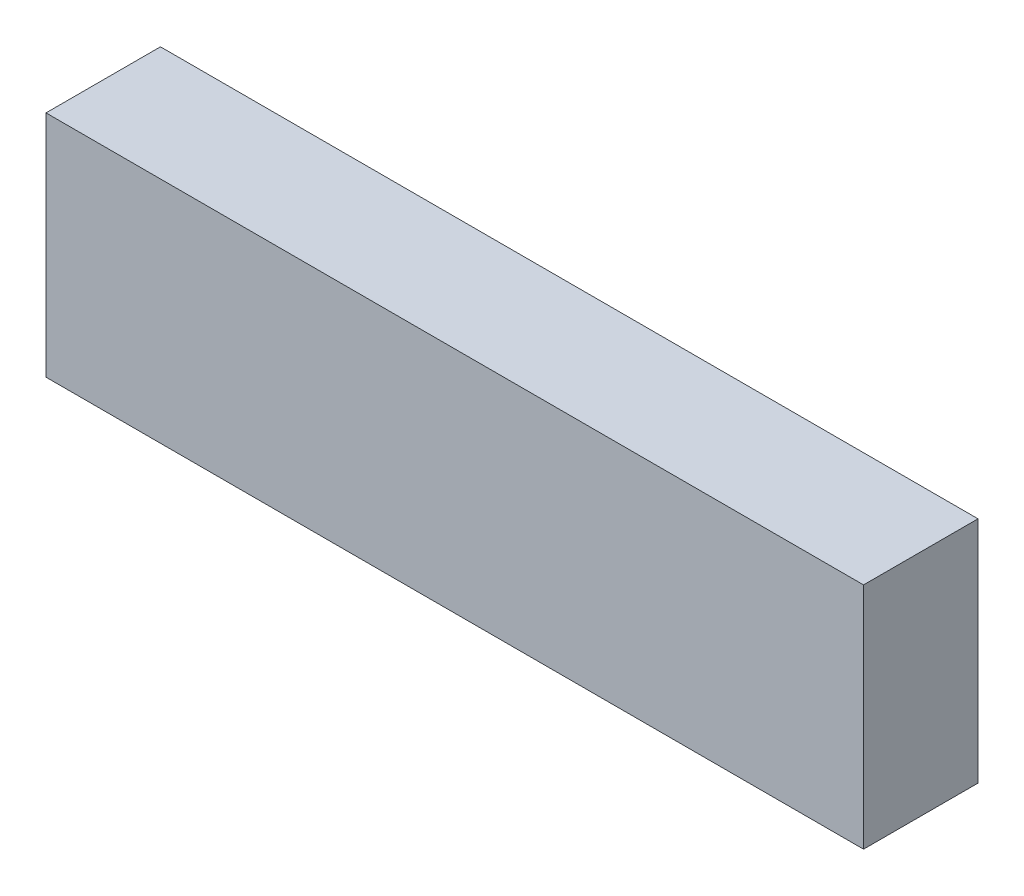
ISO-10303-21;
HEADER;
FILE_DESCRIPTION(('STEP AP214'),'2;1');
FILE_NAME('part.step','',(''),(''),'','','');
FILE_SCHEMA(('AUTOMOTIVE_DESIGN { 1 0 10303 214 1 1 1 1 }'));
ENDSEC;
DATA;
#1=APPLICATION_CONTEXT('core data for automotive mechanical design processes');
#2=APPLICATION_PROTOCOL_DEFINITION('international standard','automotive_design',2000,#1);
#3=PRODUCT_CONTEXT('',#1,'mechanical');
#4=PRODUCT('Part','Part','',(#3));
#5=PRODUCT_RELATED_PRODUCT_CATEGORY('part','',(#4));
#6=PRODUCT_DEFINITION_FORMATION('','',#4);
#7=PRODUCT_DEFINITION_CONTEXT('part definition',#1,'design');
#8=PRODUCT_DEFINITION('design','',#6,#7);
#9=PRODUCT_DEFINITION_SHAPE('','',#8);
#10=(LENGTH_UNIT() NAMED_UNIT(*) SI_UNIT(.MILLI.,.METRE.));
#11=(NAMED_UNIT(*) PLANE_ANGLE_UNIT() SI_UNIT($,.RADIAN.));
#12=(NAMED_UNIT(*) SI_UNIT($,.STERADIAN.) SOLID_ANGLE_UNIT());
#13=UNCERTAINTY_MEASURE_WITH_UNIT(LENGTH_MEASURE(1.E-05),#10,'distance_accuracy_value','');
#14=(GEOMETRIC_REPRESENTATION_CONTEXT(3) GLOBAL_UNCERTAINTY_ASSIGNED_CONTEXT((#13)) GLOBAL_UNIT_ASSIGNED_CONTEXT((#10,
#11,#12)) REPRESENTATION_CONTEXT('',''));
#15=CARTESIAN_POINT('',(0.,0.,0.));
#16=DIRECTION('',(0.,0.,1.));
#17=DIRECTION('',(1.,0.,0.));
#18=AXIS2_PLACEMENT_3D('',#15,#16,#17);
#19=CARTESIAN_POINT('',(125.,70.,-17.5));
#20=DIRECTION('',(-1.,0.,0.));
#21=DIRECTION('',(0.,0.,1.));
#22=AXIS2_PLACEMENT_3D('',#19,#20,#21);
#23=PLANE('',#22);
#24=DIRECTION('',(0.,0.,-1.));
#25=VECTOR('',#24,1.);
#26=CARTESIAN_POINT('',(125.,0.,-17.5));
#27=LINE('',#26,#25);
#28=CARTESIAN_POINT('',(125.,0.,17.5));
#29=VERTEX_POINT('',#28);
#30=CARTESIAN_POINT('',(125.,0.,-17.5));
#31=VERTEX_POINT('',#30);
#32=EDGE_CURVE('E96',#29,#31,#27,.T.);
#33=ORIENTED_EDGE('',*,*,#32,.T.);
#34=DIRECTION('',(0.,-1.,0.));
#35=VECTOR('',#34,1.);
#36=CARTESIAN_POINT('',(125.,70.,-17.5));
#37=LINE('',#36,#35);
#38=CARTESIAN_POINT('',(125.,70.,-17.5));
#39=VERTEX_POINT('',#38);
#40=EDGE_CURVE('E11',#39,#31,#37,.T.);
#41=ORIENTED_EDGE('',*,*,#40,.F.);
#42=DIRECTION('',(0.,0.,-1.));
#43=VECTOR('',#42,1.);
#44=CARTESIAN_POINT('',(125.,70.,-17.5));
#45=LINE('',#44,#43);
#46=CARTESIAN_POINT('',(125.,70.,17.5));
#47=VERTEX_POINT('',#46);
#48=EDGE_CURVE('E84',#47,#39,#45,.T.);
#49=ORIENTED_EDGE('',*,*,#48,.F.);
#50=DIRECTION('',(0.,-1.,0.));
#51=VECTOR('',#50,1.);
#52=CARTESIAN_POINT('',(125.,70.,17.5));
#53=LINE('',#52,#51);
#54=EDGE_CURVE('E92',#47,#29,#53,.T.);
#55=ORIENTED_EDGE('',*,*,#54,.T.);
#56=EDGE_LOOP('',(#33,#41,#49,#55));
#57=FACE_BOUND('',#56,.T.);
#58=ADVANCED_FACE('F33',(#57),#23,.F.);
#59=CARTESIAN_POINT('',(-125.,70.,-17.5));
#60=DIRECTION('',(0.,0.,1.));
#61=DIRECTION('',(1.,0.,0.));
#62=AXIS2_PLACEMENT_3D('',#59,#60,#61);
#63=PLANE('',#62);
#64=DIRECTION('',(-1.,0.,0.));
#65=VECTOR('',#64,1.);
#66=CARTESIAN_POINT('',(-125.,0.,-17.5));
#67=LINE('',#66,#65);
#68=CARTESIAN_POINT('',(-125.,0.,-17.5));
#69=VERTEX_POINT('',#68);
#70=EDGE_CURVE('E88',#31,#69,#67,.T.);
#71=ORIENTED_EDGE('',*,*,#70,.T.);
#72=DIRECTION('',(0.,-1.,0.));
#73=VECTOR('',#72,1.);
#74=CARTESIAN_POINT('',(-125.,70.,-17.5));
#75=LINE('',#74,#73);
#76=CARTESIAN_POINT('',(-125.,70.,-17.5));
#77=VERTEX_POINT('',#76);
#78=EDGE_CURVE('E41',#77,#69,#75,.T.);
#79=ORIENTED_EDGE('',*,*,#78,.F.);
#80=DIRECTION('',(-1.,0.,0.));
#81=VECTOR('',#80,1.);
#82=CARTESIAN_POINT('',(-125.,70.,-17.5));
#83=LINE('',#82,#81);
#84=EDGE_CURVE('E79',#39,#77,#83,.T.);
#85=ORIENTED_EDGE('',*,*,#84,.F.);
#86=ORIENTED_EDGE('',*,*,#40,.T.);
#87=EDGE_LOOP('',(#71,#79,#85,#86));
#88=FACE_BOUND('',#87,.T.);
#89=ADVANCED_FACE('F87',(#88),#63,.F.);
#90=CARTESIAN_POINT('',(-125.,70.,-17.5));
#91=DIRECTION('',(1.,0.,0.));
#92=DIRECTION('',(0.,0.,-1.));
#93=AXIS2_PLACEMENT_3D('',#90,#91,#92);
#94=PLANE('',#93);
#95=DIRECTION('',(0.,0.,1.));
#96=VECTOR('',#95,1.);
#97=CARTESIAN_POINT('',(-125.,0.,-17.5));
#98=LINE('',#97,#96);
#99=CARTESIAN_POINT('',(-125.,0.,17.5));
#100=VERTEX_POINT('',#99);
#101=EDGE_CURVE('E66',#69,#100,#98,.T.);
#102=ORIENTED_EDGE('',*,*,#101,.T.);
#103=DIRECTION('',(0.,-1.,0.));
#104=VECTOR('',#103,1.);
#105=CARTESIAN_POINT('',(-125.,70.,17.5));
#106=LINE('',#105,#104);
#107=CARTESIAN_POINT('',(-125.,70.,17.5));
#108=VERTEX_POINT('',#107);
#109=EDGE_CURVE('E89',#108,#100,#106,.T.);
#110=ORIENTED_EDGE('',*,*,#109,.F.);
#111=DIRECTION('',(0.,0.,1.));
#112=VECTOR('',#111,1.);
#113=CARTESIAN_POINT('',(-125.,70.,-17.5));
#114=LINE('',#113,#112);
#115=EDGE_CURVE('E82',#77,#108,#114,.T.);
#116=ORIENTED_EDGE('',*,*,#115,.F.);
#117=ORIENTED_EDGE('',*,*,#78,.T.);
#118=EDGE_LOOP('',(#102,#110,#116,#117));
#119=FACE_BOUND('',#118,.T.);
#120=ADVANCED_FACE('F90',(#119),#94,.F.);
#121=CARTESIAN_POINT('',(-125.,70.,17.5));
#122=DIRECTION('',(0.,0.,-1.));
#123=DIRECTION('',(-1.,0.,0.));
#124=AXIS2_PLACEMENT_3D('',#121,#122,#123);
#125=PLANE('',#124);
#126=DIRECTION('',(1.,0.,0.));
#127=VECTOR('',#126,1.);
#128=CARTESIAN_POINT('',(-125.,0.,17.5));
#129=LINE('',#128,#127);
#130=EDGE_CURVE('E72',#100,#29,#129,.T.);
#131=ORIENTED_EDGE('',*,*,#130,.T.);
#132=ORIENTED_EDGE('',*,*,#54,.F.);
#133=DIRECTION('',(1.,0.,0.));
#134=VECTOR('',#133,1.);
#135=CARTESIAN_POINT('',(-125.,70.,17.5));
#136=LINE('',#135,#134);
#137=EDGE_CURVE('E49',#108,#47,#136,.T.);
#138=ORIENTED_EDGE('',*,*,#137,.F.);
#139=ORIENTED_EDGE('',*,*,#109,.T.);
#140=EDGE_LOOP('',(#131,#132,#138,#139));
#141=FACE_BOUND('',#140,.T.);
#142=ADVANCED_FACE('F103',(#141),#125,.F.);
#143=CARTESIAN_POINT('',(0.,70.,0.));
#144=DIRECTION('',(0.,1.,0.));
#145=DIRECTION('',(0.,0.,1.));
#146=AXIS2_PLACEMENT_3D('',#143,#144,#145);
#147=PLANE('',#146);
#148=ORIENTED_EDGE('',*,*,#48,.T.);
#149=ORIENTED_EDGE('',*,*,#84,.T.);
#150=ORIENTED_EDGE('',*,*,#115,.T.);
#151=ORIENTED_EDGE('',*,*,#137,.T.);
#152=EDGE_LOOP('',(#148,#149,#150,#151));
#153=FACE_BOUND('',#152,.T.);
#154=ADVANCED_FACE('F80',(#153),#147,.T.);
#155=CARTESIAN_POINT('',(0.,0.,0.));
#156=DIRECTION('',(0.,1.,0.));
#157=DIRECTION('',(0.,0.,1.));
#158=AXIS2_PLACEMENT_3D('',#155,#156,#157);
#159=PLANE('',#158);
#160=ORIENTED_EDGE('',*,*,#32,.F.);
#161=ORIENTED_EDGE('',*,*,#130,.F.);
#162=ORIENTED_EDGE('',*,*,#101,.F.);
#163=ORIENTED_EDGE('',*,*,#70,.F.);
#164=EDGE_LOOP('',(#160,#161,#162,#163));
#165=FACE_BOUND('',#164,.T.);
#166=ADVANCED_FACE('F106',(#165),#159,.F.);
#167=CLOSED_SHELL('',(#58,#89,#120,#142,#154,#166));
#168=MANIFOLD_SOLID_BREP('B2',#167);
#169=ADVANCED_BREP_SHAPE_REPRESENTATION('',(#18,#168),#14);
#170=SHAPE_DEFINITION_REPRESENTATION(#9,#169);
ENDSEC;
END-ISO-10303-21;
